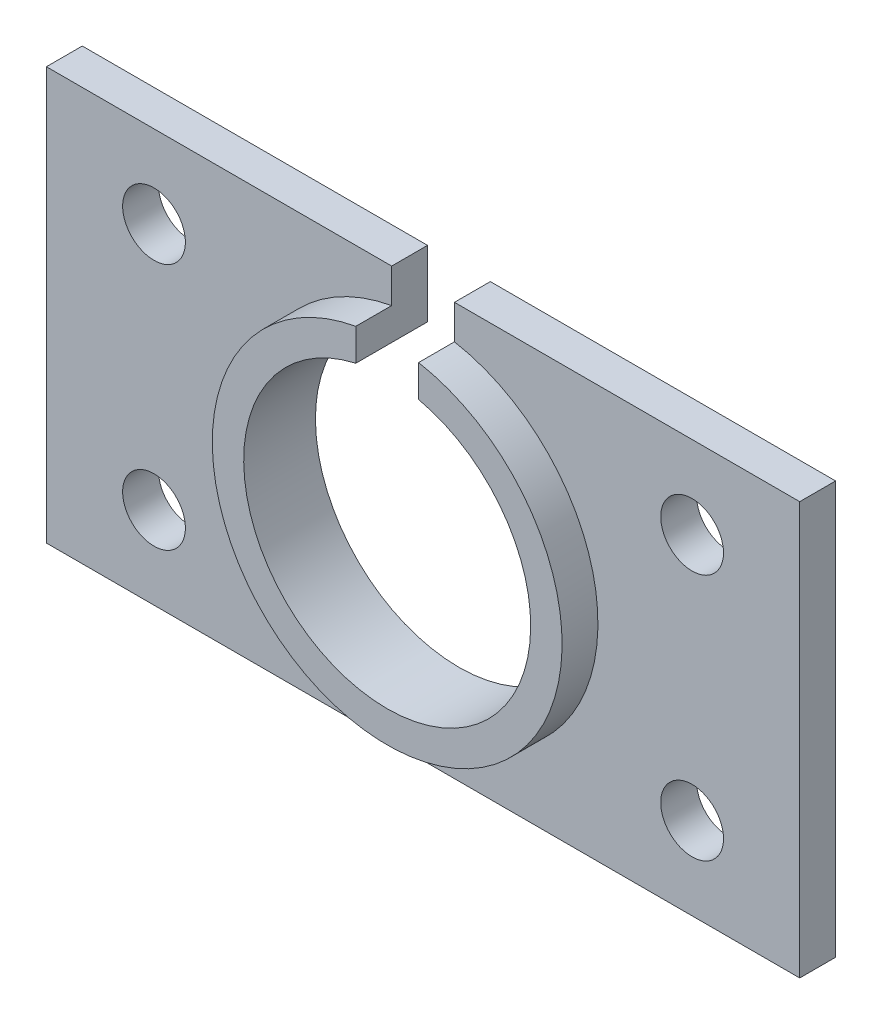
ISO-10303-21;
HEADER;
FILE_DESCRIPTION(('STEP AP214'),'2;1');
FILE_NAME('part.step','',(''),(''),'','','');
FILE_SCHEMA(('AUTOMOTIVE_DESIGN { 1 0 10303 214 1 1 1 1 }'));
ENDSEC;
DATA;
#1=APPLICATION_CONTEXT('core data for automotive mechanical design processes');
#2=APPLICATION_PROTOCOL_DEFINITION('international standard','automotive_design',2000,#1);
#3=PRODUCT_CONTEXT('',#1,'mechanical');
#4=PRODUCT('Part','Part','',(#3));
#5=PRODUCT_RELATED_PRODUCT_CATEGORY('part','',(#4));
#6=PRODUCT_DEFINITION_FORMATION('','',#4);
#7=PRODUCT_DEFINITION_CONTEXT('part definition',#1,'design');
#8=PRODUCT_DEFINITION('design','',#6,#7);
#9=PRODUCT_DEFINITION_SHAPE('','',#8);
#10=(LENGTH_UNIT() NAMED_UNIT(*) SI_UNIT(.MILLI.,.METRE.));
#11=(NAMED_UNIT(*) PLANE_ANGLE_UNIT() SI_UNIT($,.RADIAN.));
#12=(NAMED_UNIT(*) SI_UNIT($,.STERADIAN.) SOLID_ANGLE_UNIT());
#13=UNCERTAINTY_MEASURE_WITH_UNIT(LENGTH_MEASURE(1.E-05),#10,'distance_accuracy_value','');
#14=(GEOMETRIC_REPRESENTATION_CONTEXT(3) GLOBAL_UNCERTAINTY_ASSIGNED_CONTEXT((#13)) GLOBAL_UNIT_ASSIGNED_CONTEXT((#10,
#11,#12)) REPRESENTATION_CONTEXT('',''));
#15=CARTESIAN_POINT('',(0.,0.,0.));
#16=DIRECTION('',(0.,0.,1.));
#17=DIRECTION('',(1.,0.,0.));
#18=AXIS2_PLACEMENT_3D('',#15,#16,#17);
#19=CARTESIAN_POINT('',(3.99999999999999,50.,2.));
#20=DIRECTION('',(0.,-1.,0.));
#21=DIRECTION('',(1.,0.,0.));
#22=AXIS2_PLACEMENT_3D('',#19,#20,#21);
#23=PLANE('',#22);
#24=DIRECTION('',(-1.,0.,0.));
#25=VECTOR('',#24,1.);
#26=CARTESIAN_POINT('',(3.99999999999999,50.,0.));
#27=LINE('',#26,#25);
#28=CARTESIAN_POINT('',(46.,50.,0.));
#29=VERTEX_POINT('',#28);
#30=CARTESIAN_POINT('',(26.75,50.,0.));
#31=VERTEX_POINT('',#30);
#32=EDGE_CURVE('E129',#29,#31,#27,.T.);
#33=ORIENTED_EDGE('',*,*,#32,.T.);
#34=DIRECTION('',(0.,0.,-1.));
#35=VECTOR('',#34,1.);
#36=CARTESIAN_POINT('',(26.75,50.,4.001));
#37=LINE('',#36,#35);
#38=CARTESIAN_POINT('',(26.75,50.,2.));
#39=VERTEX_POINT('',#38);
#40=EDGE_CURVE('E113',#39,#31,#37,.T.);
#41=ORIENTED_EDGE('',*,*,#40,.F.);
#42=DIRECTION('',(-1.,0.,0.));
#43=VECTOR('',#42,1.);
#44=CARTESIAN_POINT('',(3.99999999999999,50.,2.));
#45=LINE('',#44,#43);
#46=CARTESIAN_POINT('',(46.,50.,2.));
#47=VERTEX_POINT('',#46);
#48=EDGE_CURVE('E151',#47,#39,#45,.T.);
#49=ORIENTED_EDGE('',*,*,#48,.F.);
#50=DIRECTION('',(0.,0.,-1.));
#51=VECTOR('',#50,1.);
#52=CARTESIAN_POINT('',(46.,50.,2.));
#53=LINE('',#52,#51);
#54=EDGE_CURVE('E137',#47,#29,#53,.T.);
#55=ORIENTED_EDGE('',*,*,#54,.T.);
#56=EDGE_LOOP('',(#33,#41,#49,#55));
#57=FACE_BOUND('',#56,.T.);
#58=ADVANCED_FACE('F36',(#57),#23,.F.);
#59=CARTESIAN_POINT('',(3.99999999999999,50.,2.));
#60=DIRECTION('',(1.,0.,0.));
#61=DIRECTION('',(0.,1.,0.));
#62=AXIS2_PLACEMENT_3D('',#59,#60,#61);
#63=PLANE('',#62);
#64=DIRECTION('',(0.,-1.,0.));
#65=VECTOR('',#64,1.);
#66=CARTESIAN_POINT('',(3.99999999999999,50.,0.));
#67=LINE('',#66,#65);
#68=CARTESIAN_POINT('',(3.99999999999999,50.,0.));
#69=VERTEX_POINT('',#68);
#70=CARTESIAN_POINT('',(4.,27.,0.));
#71=VERTEX_POINT('',#70);
#72=EDGE_CURVE('E189',#69,#71,#67,.T.);
#73=ORIENTED_EDGE('',*,*,#72,.T.);
#74=DIRECTION('',(0.,0.,-1.));
#75=VECTOR('',#74,1.);
#76=CARTESIAN_POINT('',(4.,27.,2.));
#77=LINE('',#76,#75);
#78=CARTESIAN_POINT('',(4.,27.,2.));
#79=VERTEX_POINT('',#78);
#80=EDGE_CURVE('E45',#79,#71,#77,.T.);
#81=ORIENTED_EDGE('',*,*,#80,.F.);
#82=DIRECTION('',(0.,-1.,0.));
#83=VECTOR('',#82,1.);
#84=CARTESIAN_POINT('',(3.99999999999999,50.,2.));
#85=LINE('',#84,#83);
#86=CARTESIAN_POINT('',(3.99999999999999,50.,2.));
#87=VERTEX_POINT('',#86);
#88=EDGE_CURVE('E138',#87,#79,#85,.T.);
#89=ORIENTED_EDGE('',*,*,#88,.F.);
#90=DIRECTION('',(0.,0.,-1.));
#91=VECTOR('',#90,1.);
#92=CARTESIAN_POINT('',(3.99999999999999,50.,2.));
#93=LINE('',#92,#91);
#94=EDGE_CURVE('E148',#87,#69,#93,.T.);
#95=ORIENTED_EDGE('',*,*,#94,.T.);
#96=EDGE_LOOP('',(#73,#81,#89,#95));
#97=FACE_BOUND('',#96,.T.);
#98=ADVANCED_FACE('F38',(#97),#63,.F.);
#99=CARTESIAN_POINT('',(4.,27.,2.));
#100=DIRECTION('',(0.,1.,0.));
#101=DIRECTION('',(-1.,0.,0.));
#102=AXIS2_PLACEMENT_3D('',#99,#100,#101);
#103=PLANE('',#102);
#104=DIRECTION('',(1.,0.,0.));
#105=VECTOR('',#104,1.);
#106=CARTESIAN_POINT('',(4.,27.,0.));
#107=LINE('',#106,#105);
#108=CARTESIAN_POINT('',(46.,27.,0.));
#109=VERTEX_POINT('',#108);
#110=EDGE_CURVE('E197',#71,#109,#107,.T.);
#111=ORIENTED_EDGE('',*,*,#110,.T.);
#112=DIRECTION('',(0.,0.,-1.));
#113=VECTOR('',#112,1.);
#114=CARTESIAN_POINT('',(46.,27.,2.));
#115=LINE('',#114,#113);
#116=CARTESIAN_POINT('',(46.,27.,2.));
#117=VERTEX_POINT('',#116);
#118=EDGE_CURVE('E153',#117,#109,#115,.T.);
#119=ORIENTED_EDGE('',*,*,#118,.F.);
#120=DIRECTION('',(1.,0.,0.));
#121=VECTOR('',#120,1.);
#122=CARTESIAN_POINT('',(4.,27.,2.));
#123=LINE('',#122,#121);
#124=EDGE_CURVE('E142',#79,#117,#123,.T.);
#125=ORIENTED_EDGE('',*,*,#124,.F.);
#126=ORIENTED_EDGE('',*,*,#80,.T.);
#127=EDGE_LOOP('',(#111,#119,#125,#126));
#128=FACE_BOUND('',#127,.T.);
#129=ADVANCED_FACE('F206',(#128),#103,.F.);
#130=CARTESIAN_POINT('',(46.,50.,2.));
#131=DIRECTION('',(-1.,0.,0.));
#132=DIRECTION('',(0.,0.,1.));
#133=AXIS2_PLACEMENT_3D('',#130,#131,#132);
#134=PLANE('',#133);
#135=DIRECTION('',(0.,1.,0.));
#136=VECTOR('',#135,1.);
#137=CARTESIAN_POINT('',(46.,50.,0.));
#138=LINE('',#137,#136);
#139=EDGE_CURVE('E144',#109,#29,#138,.T.);
#140=ORIENTED_EDGE('',*,*,#139,.T.);
#141=ORIENTED_EDGE('',*,*,#54,.F.);
#142=DIRECTION('',(0.,1.,0.));
#143=VECTOR('',#142,1.);
#144=CARTESIAN_POINT('',(46.,50.,2.));
#145=LINE('',#144,#143);
#146=EDGE_CURVE('E192',#117,#47,#145,.T.);
#147=ORIENTED_EDGE('',*,*,#146,.F.);
#148=ORIENTED_EDGE('',*,*,#118,.T.);
#149=EDGE_LOOP('',(#140,#141,#147,#148));
#150=FACE_BOUND('',#149,.T.);
#151=ADVANCED_FACE('F201',(#150),#134,.F.);
#152=CARTESIAN_POINT('',(23.25,50.,2.));
#153=VERTEX_POINT('',#152);
#154=EDGE_CURVE('E194',#153,#87,#45,.T.);
#155=ORIENTED_EDGE('',*,*,#154,.F.);
#156=DIRECTION('',(0.,0.,1.));
#157=VECTOR('',#156,1.);
#158=CARTESIAN_POINT('',(23.25,50.,4.001));
#159=LINE('',#158,#157);
#160=CARTESIAN_POINT('',(23.25,50.,0.));
#161=VERTEX_POINT('',#160);
#162=EDGE_CURVE('E122',#161,#153,#159,.T.);
#163=ORIENTED_EDGE('',*,*,#162,.F.);
#164=EDGE_CURVE('E139',#161,#69,#27,.T.);
#165=ORIENTED_EDGE('',*,*,#164,.T.);
#166=ORIENTED_EDGE('',*,*,#94,.F.);
#167=EDGE_LOOP('',(#155,#163,#165,#166));
#168=FACE_BOUND('',#167,.T.);
#169=ADVANCED_FACE('F212',(#168),#23,.F.);
#170=CARTESIAN_POINT('',(0.,0.,2.));
#171=DIRECTION('',(0.,0.,1.));
#172=DIRECTION('',(1.,0.,0.));
#173=AXIS2_PLACEMENT_3D('',#170,#171,#172);
#174=PLANE('',#173);
#175=DIRECTION('',(0.,-1.,0.));
#176=VECTOR('',#175,1.);
#177=CARTESIAN_POINT('',(26.75,54.1148620066534,2.));
#178=LINE('',#177,#176);
#179=CARTESIAN_POINT('',(26.75,48.0916630466254,2.));
#180=VERTEX_POINT('',#179);
#181=EDGE_CURVE('E116',#39,#180,#178,.T.);
#182=ORIENTED_EDGE('',*,*,#181,.T.);
#183=CARTESIAN_POINT('',(25.,38.5,2.));
#184=DIRECTION('',(0.,0.,1.));
#185=DIRECTION('',(1.,0.,0.));
#186=AXIS2_PLACEMENT_3D('',#183,#184,#185);
#187=CIRCLE('',#186,9.75);
#188=CARTESIAN_POINT('',(23.25,48.0916630466254,2.));
#189=VERTEX_POINT('',#188);
#190=EDGE_CURVE('E11',#189,#180,#187,.T.);
#191=ORIENTED_EDGE('',*,*,#190,.F.);
#192=DIRECTION('',(0.,1.,0.));
#193=VECTOR('',#192,1.);
#194=CARTESIAN_POINT('',(23.25,54.1148620066534,2.));
#195=LINE('',#194,#193);
#196=EDGE_CURVE('E162',#189,#153,#195,.T.);
#197=ORIENTED_EDGE('',*,*,#196,.T.);
#198=ORIENTED_EDGE('',*,*,#154,.T.);
#199=ORIENTED_EDGE('',*,*,#88,.T.);
#200=ORIENTED_EDGE('',*,*,#124,.T.);
#201=ORIENTED_EDGE('',*,*,#146,.T.);
#202=ORIENTED_EDGE('',*,*,#48,.T.);
#203=EDGE_LOOP('',(#182,#191,#197,#198,#199,#200,#201,#202));
#204=FACE_BOUND('',#203,.T.);
#205=CARTESIAN_POINT('',(10.,45.4,2.));
#206=DIRECTION('',(0.,0.,1.));
#207=DIRECTION('',(1.,0.,0.));
#208=AXIS2_PLACEMENT_3D('',#205,#206,#207);
#209=CIRCLE('',#208,1.75);
#210=CARTESIAN_POINT('',(11.75,45.4,2.));
#211=VERTEX_POINT('',#210);
#212=EDGE_CURVE('E180',#211,#211,#209,.T.);
#213=ORIENTED_EDGE('',*,*,#212,.F.);
#214=EDGE_LOOP('',(#213));
#215=FACE_BOUND('',#214,.T.);
#216=CARTESIAN_POINT('',(10.,31.6,2.));
#217=DIRECTION('',(0.,0.,1.));
#218=DIRECTION('',(1.,0.,0.));
#219=AXIS2_PLACEMENT_3D('',#216,#217,#218);
#220=CIRCLE('',#219,1.75);
#221=CARTESIAN_POINT('',(11.75,31.6,2.));
#222=VERTEX_POINT('',#221);
#223=EDGE_CURVE('E168',#222,#222,#220,.T.);
#224=ORIENTED_EDGE('',*,*,#223,.F.);
#225=EDGE_LOOP('',(#224));
#226=FACE_BOUND('',#225,.T.);
#227=CARTESIAN_POINT('',(40.,31.6,2.));
#228=DIRECTION('',(0.,0.,1.));
#229=DIRECTION('',(1.,0.,0.));
#230=AXIS2_PLACEMENT_3D('',#227,#228,#229);
#231=CIRCLE('',#230,1.75);
#232=CARTESIAN_POINT('',(41.75,31.6,2.));
#233=VERTEX_POINT('',#232);
#234=EDGE_CURVE('E165',#233,#233,#231,.T.);
#235=ORIENTED_EDGE('',*,*,#234,.F.);
#236=EDGE_LOOP('',(#235));
#237=FACE_BOUND('',#236,.T.);
#238=CARTESIAN_POINT('',(40.,45.4,2.));
#239=DIRECTION('',(0.,0.,1.));
#240=DIRECTION('',(1.,0.,0.));
#241=AXIS2_PLACEMENT_3D('',#238,#239,#240);
#242=CIRCLE('',#241,1.75);
#243=CARTESIAN_POINT('',(41.75,45.4,2.));
#244=VERTEX_POINT('',#243);
#245=EDGE_CURVE('E161',#244,#244,#242,.T.);
#246=ORIENTED_EDGE('',*,*,#245,.F.);
#247=EDGE_LOOP('',(#246));
#248=FACE_BOUND('',#247,.T.);
#249=ADVANCED_FACE('F234',(#204,#215,#226,#237,#248),#174,.T.);
#250=CARTESIAN_POINT('',(0.,0.,0.));
#251=DIRECTION('',(0.,0.,1.));
#252=DIRECTION('',(1.,0.,0.));
#253=AXIS2_PLACEMENT_3D('',#250,#251,#252);
#254=PLANE('',#253);
#255=CARTESIAN_POINT('',(10.,45.4,0.));
#256=DIRECTION('',(0.,0.,1.));
#257=DIRECTION('',(1.,0.,0.));
#258=AXIS2_PLACEMENT_3D('',#255,#256,#257);
#259=CIRCLE('',#258,1.75);
#260=CARTESIAN_POINT('',(11.75,45.4,0.));
#261=VERTEX_POINT('',#260);
#262=EDGE_CURVE('E40',#261,#261,#259,.T.);
#263=ORIENTED_EDGE('',*,*,#262,.T.);
#264=EDGE_LOOP('',(#263));
#265=FACE_BOUND('',#264,.T.);
#266=CARTESIAN_POINT('',(10.,31.6,0.));
#267=DIRECTION('',(0.,0.,1.));
#268=DIRECTION('',(1.,0.,0.));
#269=AXIS2_PLACEMENT_3D('',#266,#267,#268);
#270=CIRCLE('',#269,1.75);
#271=CARTESIAN_POINT('',(11.75,31.6,0.));
#272=VERTEX_POINT('',#271);
#273=EDGE_CURVE('E166',#272,#272,#270,.T.);
#274=ORIENTED_EDGE('',*,*,#273,.T.);
#275=EDGE_LOOP('',(#274));
#276=FACE_BOUND('',#275,.T.);
#277=CARTESIAN_POINT('',(40.,31.6,0.));
#278=DIRECTION('',(0.,0.,1.));
#279=DIRECTION('',(1.,0.,0.));
#280=AXIS2_PLACEMENT_3D('',#277,#278,#279);
#281=CIRCLE('',#280,1.75);
#282=CARTESIAN_POINT('',(41.75,31.6,0.));
#283=VERTEX_POINT('',#282);
#284=EDGE_CURVE('E163',#283,#283,#281,.T.);
#285=ORIENTED_EDGE('',*,*,#284,.T.);
#286=EDGE_LOOP('',(#285));
#287=FACE_BOUND('',#286,.T.);
#288=CARTESIAN_POINT('',(40.,45.4,0.));
#289=DIRECTION('',(0.,0.,1.));
#290=DIRECTION('',(1.,0.,0.));
#291=AXIS2_PLACEMENT_3D('',#288,#289,#290);
#292=CIRCLE('',#291,1.75);
#293=CARTESIAN_POINT('',(41.75,45.4,0.));
#294=VERTEX_POINT('',#293);
#295=EDGE_CURVE('E158',#294,#294,#292,.T.);
#296=ORIENTED_EDGE('',*,*,#295,.T.);
#297=EDGE_LOOP('',(#296));
#298=FACE_BOUND('',#297,.T.);
#299=CARTESIAN_POINT('',(25.,38.5,0.));
#300=DIRECTION('',(0.,0.,1.));
#301=DIRECTION('',(1.,0.,0.));
#302=AXIS2_PLACEMENT_3D('',#299,#300,#301);
#303=CIRCLE('',#302,8.);
#304=CARTESIAN_POINT('',(23.25,46.306247497998,0.));
#305=VERTEX_POINT('',#304);
#306=CARTESIAN_POINT('',(26.75,46.306247497998,0.));
#307=VERTEX_POINT('',#306);
#308=EDGE_CURVE('E132',#305,#307,#303,.T.);
#309=ORIENTED_EDGE('',*,*,#308,.T.);
#310=DIRECTION('',(0.,-1.,0.));
#311=VECTOR('',#310,1.);
#312=CARTESIAN_POINT('',(26.75,54.1148620066534,0.));
#313=LINE('',#312,#311);
#314=EDGE_CURVE('E61',#31,#307,#313,.T.);
#315=ORIENTED_EDGE('',*,*,#314,.F.);
#316=ORIENTED_EDGE('',*,*,#32,.F.);
#317=ORIENTED_EDGE('',*,*,#139,.F.);
#318=ORIENTED_EDGE('',*,*,#110,.F.);
#319=ORIENTED_EDGE('',*,*,#72,.F.);
#320=ORIENTED_EDGE('',*,*,#164,.F.);
#321=DIRECTION('',(0.,1.,0.));
#322=VECTOR('',#321,1.);
#323=CARTESIAN_POINT('',(23.25,54.1148620066534,0.));
#324=LINE('',#323,#322);
#325=EDGE_CURVE('E133',#305,#161,#324,.T.);
#326=ORIENTED_EDGE('',*,*,#325,.F.);
#327=EDGE_LOOP('',(#309,#315,#316,#317,#318,#319,#320,#326));
#328=FACE_BOUND('',#327,.T.);
#329=ADVANCED_FACE('F127',(#265,#276,#287,#298,#328),#254,.F.);
#330=CARTESIAN_POINT('',(25.,38.5,4.));
#331=DIRECTION('',(0.,0.,-1.));
#332=DIRECTION('',(-1.,0.,0.));
#333=AXIS2_PLACEMENT_3D('',#330,#331,#332);
#334=CYLINDRICAL_SURFACE('',#333,9.75);
#335=ORIENTED_EDGE('',*,*,#190,.T.);
#336=DIRECTION('',(0.,0.,-1.));
#337=VECTOR('',#336,1.);
#338=CARTESIAN_POINT('',(26.75,48.0916630466254,4.));
#339=LINE('',#338,#337);
#340=CARTESIAN_POINT('',(26.75,48.0916630466254,4.));
#341=VERTEX_POINT('',#340);
#342=EDGE_CURVE('E226',#341,#180,#339,.T.);
#343=ORIENTED_EDGE('',*,*,#342,.F.);
#344=CARTESIAN_POINT('',(25.,38.5,4.));
#345=DIRECTION('',(0.,0.,1.));
#346=DIRECTION('',(1.,0.,0.));
#347=AXIS2_PLACEMENT_3D('',#344,#345,#346);
#348=CIRCLE('',#347,9.75);
#349=CARTESIAN_POINT('',(23.25,48.0916630466254,4.));
#350=VERTEX_POINT('',#349);
#351=EDGE_CURVE('E185',#350,#341,#348,.T.);
#352=ORIENTED_EDGE('',*,*,#351,.F.);
#353=DIRECTION('',(0.,0.,-1.));
#354=VECTOR('',#353,1.);
#355=CARTESIAN_POINT('',(23.25,48.0916630466254,4.));
#356=LINE('',#355,#354);
#357=EDGE_CURVE('E230',#189,#350,#356,.F.);
#358=ORIENTED_EDGE('',*,*,#357,.F.);
#359=EDGE_LOOP('',(#335,#343,#352,#358));
#360=FACE_BOUND('',#359,.T.);
#361=ADVANCED_FACE('F240',(#360),#334,.T.);
#362=CARTESIAN_POINT('',(25.,38.5,4.));
#363=DIRECTION('',(0.,0.,1.));
#364=DIRECTION('',(1.,0.,0.));
#365=AXIS2_PLACEMENT_3D('',#362,#363,#364);
#366=PLANE('',#365);
#367=DIRECTION('',(0.,-1.,0.));
#368=VECTOR('',#367,1.);
#369=CARTESIAN_POINT('',(26.75,54.1148620066534,4.));
#370=LINE('',#369,#368);
#371=CARTESIAN_POINT('',(26.75,46.306247497998,4.));
#372=VERTEX_POINT('',#371);
#373=EDGE_CURVE('E121',#341,#372,#370,.T.);
#374=ORIENTED_EDGE('',*,*,#373,.T.);
#375=CARTESIAN_POINT('',(25.,38.5,4.));
#376=DIRECTION('',(0.,0.,1.));
#377=DIRECTION('',(1.,0.,0.));
#378=AXIS2_PLACEMENT_3D('',#375,#376,#377);
#379=CIRCLE('',#378,8.);
#380=CARTESIAN_POINT('',(23.25,46.306247497998,4.));
#381=VERTEX_POINT('',#380);
#382=EDGE_CURVE('E183',#381,#372,#379,.T.);
#383=ORIENTED_EDGE('',*,*,#382,.F.);
#384=DIRECTION('',(0.,1.,0.));
#385=VECTOR('',#384,1.);
#386=CARTESIAN_POINT('',(23.25,54.1148620066534,4.));
#387=LINE('',#386,#385);
#388=EDGE_CURVE('E53',#381,#350,#387,.T.);
#389=ORIENTED_EDGE('',*,*,#388,.T.);
#390=ORIENTED_EDGE('',*,*,#351,.T.);
#391=EDGE_LOOP('',(#374,#383,#389,#390));
#392=FACE_BOUND('',#391,.T.);
#393=ADVANCED_FACE('F243',(#392),#366,.T.);
#394=CARTESIAN_POINT('',(25.,38.5,0.));
#395=DIRECTION('',(0.,0.,1.));
#396=DIRECTION('',(1.,0.,0.));
#397=AXIS2_PLACEMENT_3D('',#394,#395,#396);
#398=CYLINDRICAL_SURFACE('',#397,8.);
#399=ORIENTED_EDGE('',*,*,#382,.T.);
#400=DIRECTION('',(0.,0.,1.));
#401=VECTOR('',#400,1.);
#402=CARTESIAN_POINT('',(26.75,46.306247497998,0.));
#403=LINE('',#402,#401);
#404=EDGE_CURVE('E219',#307,#372,#403,.T.);
#405=ORIENTED_EDGE('',*,*,#404,.F.);
#406=ORIENTED_EDGE('',*,*,#308,.F.);
#407=DIRECTION('',(0.,0.,1.));
#408=VECTOR('',#407,1.);
#409=CARTESIAN_POINT('',(23.25,46.306247497998,0.));
#410=LINE('',#409,#408);
#411=EDGE_CURVE('E217',#381,#305,#410,.F.);
#412=ORIENTED_EDGE('',*,*,#411,.F.);
#413=EDGE_LOOP('',(#399,#405,#406,#412));
#414=FACE_BOUND('',#413,.T.);
#415=ADVANCED_FACE('F216',(#414),#398,.F.);
#416=CARTESIAN_POINT('',(40.,45.4,4.));
#417=DIRECTION('',(0.,0.,-1.));
#418=DIRECTION('',(-1.,0.,0.));
#419=AXIS2_PLACEMENT_3D('',#416,#417,#418);
#420=CYLINDRICAL_SURFACE('',#419,1.75);
#421=ORIENTED_EDGE('',*,*,#245,.T.);
#422=EDGE_LOOP('',(#421));
#423=FACE_BOUND('',#422,.T.);
#424=ORIENTED_EDGE('',*,*,#295,.F.);
#425=EDGE_LOOP('',(#424));
#426=FACE_BOUND('',#425,.T.);
#427=ADVANCED_FACE('F250',(#423,#426),#420,.F.);
#428=CARTESIAN_POINT('',(40.,31.6,4.));
#429=DIRECTION('',(0.,0.,-1.));
#430=DIRECTION('',(-1.,0.,0.));
#431=AXIS2_PLACEMENT_3D('',#428,#429,#430);
#432=CYLINDRICAL_SURFACE('',#431,1.75);
#433=ORIENTED_EDGE('',*,*,#234,.T.);
#434=EDGE_LOOP('',(#433));
#435=FACE_BOUND('',#434,.T.);
#436=ORIENTED_EDGE('',*,*,#284,.F.);
#437=EDGE_LOOP('',(#436));
#438=FACE_BOUND('',#437,.T.);
#439=ADVANCED_FACE('F322',(#435,#438),#432,.F.);
#440=CARTESIAN_POINT('',(10.,31.6,4.));
#441=DIRECTION('',(0.,0.,-1.));
#442=DIRECTION('',(-1.,0.,0.));
#443=AXIS2_PLACEMENT_3D('',#440,#441,#442);
#444=CYLINDRICAL_SURFACE('',#443,1.75);
#445=ORIENTED_EDGE('',*,*,#223,.T.);
#446=EDGE_LOOP('',(#445));
#447=FACE_BOUND('',#446,.T.);
#448=ORIENTED_EDGE('',*,*,#273,.F.);
#449=EDGE_LOOP('',(#448));
#450=FACE_BOUND('',#449,.T.);
#451=ADVANCED_FACE('F331',(#447,#450),#444,.F.);
#452=CARTESIAN_POINT('',(10.,45.4,4.));
#453=DIRECTION('',(0.,0.,-1.));
#454=DIRECTION('',(-1.,0.,0.));
#455=AXIS2_PLACEMENT_3D('',#452,#453,#454);
#456=CYLINDRICAL_SURFACE('',#455,1.75);
#457=ORIENTED_EDGE('',*,*,#212,.T.);
#458=EDGE_LOOP('',(#457));
#459=FACE_BOUND('',#458,.T.);
#460=ORIENTED_EDGE('',*,*,#262,.F.);
#461=EDGE_LOOP('',(#460));
#462=FACE_BOUND('',#461,.T.);
#463=ADVANCED_FACE('F339',(#459,#462),#456,.F.);
#464=CARTESIAN_POINT('',(23.25,54.1148620066534,4.001));
#465=DIRECTION('',(-1.,0.,0.));
#466=DIRECTION('',(0.,-1.,0.));
#467=AXIS2_PLACEMENT_3D('',#464,#465,#466);
#468=PLANE('',#467);
#469=ORIENTED_EDGE('',*,*,#162,.T.);
#470=ORIENTED_EDGE('',*,*,#196,.F.);
#471=ORIENTED_EDGE('',*,*,#357,.T.);
#472=ORIENTED_EDGE('',*,*,#388,.F.);
#473=ORIENTED_EDGE('',*,*,#411,.T.);
#474=ORIENTED_EDGE('',*,*,#325,.T.);
#475=EDGE_LOOP('',(#469,#470,#471,#472,#473,#474));
#476=FACE_BOUND('',#475,.T.);
#477=ADVANCED_FACE('F237',(#476),#468,.F.);
#478=CARTESIAN_POINT('',(26.75,54.1148620066534,4.001));
#479=DIRECTION('',(1.,0.,0.));
#480=DIRECTION('',(0.,1.,0.));
#481=AXIS2_PLACEMENT_3D('',#478,#479,#480);
#482=PLANE('',#481);
#483=ORIENTED_EDGE('',*,*,#40,.T.);
#484=ORIENTED_EDGE('',*,*,#314,.T.);
#485=ORIENTED_EDGE('',*,*,#404,.T.);
#486=ORIENTED_EDGE('',*,*,#373,.F.);
#487=ORIENTED_EDGE('',*,*,#342,.T.);
#488=ORIENTED_EDGE('',*,*,#181,.F.);
#489=EDGE_LOOP('',(#483,#484,#485,#486,#487,#488));
#490=FACE_BOUND('',#489,.T.);
#491=ADVANCED_FACE('F114',(#490),#482,.F.);
#492=CLOSED_SHELL('',(#58,#98,#129,#151,#169,#249,#329,#361,#393,#415,#427,#439,#451,#463,#477,#491));
#493=MANIFOLD_SOLID_BREP('B2',#492);
#494=ADVANCED_BREP_SHAPE_REPRESENTATION('',(#18,#493),#14);
#495=SHAPE_DEFINITION_REPRESENTATION(#9,#494);
ENDSEC;
END-ISO-10303-21;
